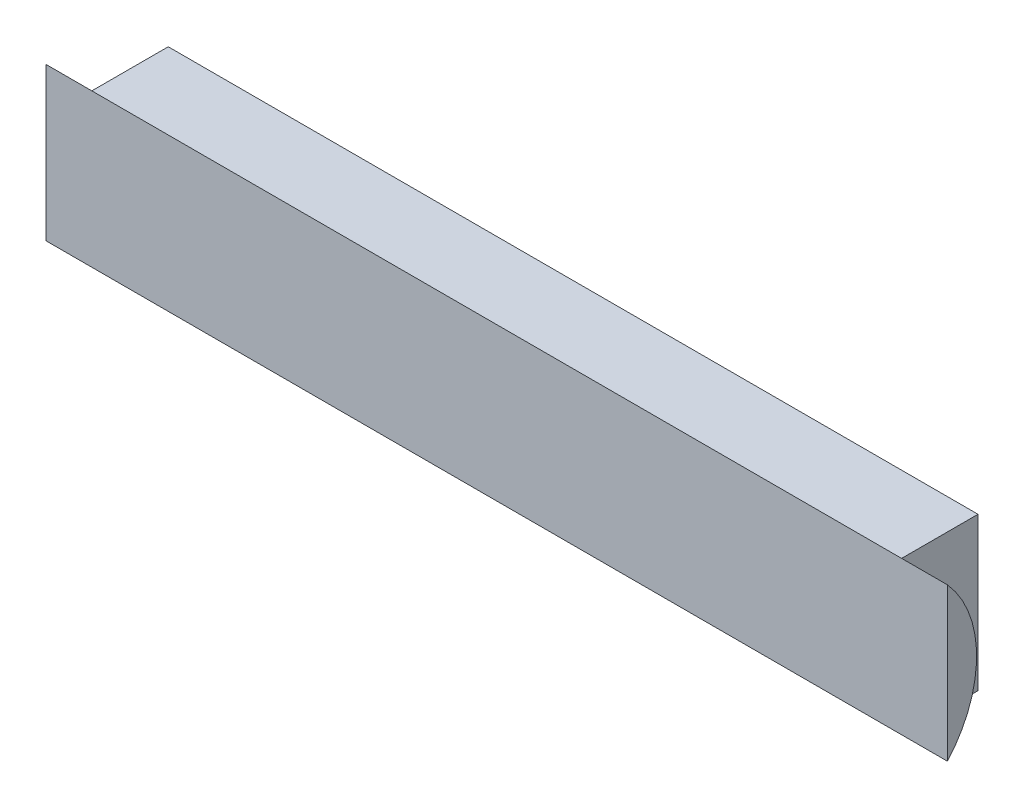
ISO-10303-21;
HEADER;
FILE_DESCRIPTION(('STEP AP214'),'2;1');
FILE_NAME('part.step','',(''),(''),'','','');
FILE_SCHEMA(('AUTOMOTIVE_DESIGN { 1 0 10303 214 1 1 1 1 }'));
ENDSEC;
DATA;
#1=APPLICATION_CONTEXT('core data for automotive mechanical design processes');
#2=APPLICATION_PROTOCOL_DEFINITION('international standard','automotive_design',2000,#1);
#3=PRODUCT_CONTEXT('',#1,'mechanical');
#4=PRODUCT('Part','Part','',(#3));
#5=PRODUCT_RELATED_PRODUCT_CATEGORY('part','',(#4));
#6=PRODUCT_DEFINITION_FORMATION('','',#4);
#7=PRODUCT_DEFINITION_CONTEXT('part definition',#1,'design');
#8=PRODUCT_DEFINITION('design','',#6,#7);
#9=PRODUCT_DEFINITION_SHAPE('','',#8);
#10=(LENGTH_UNIT() NAMED_UNIT(*) SI_UNIT(.MILLI.,.METRE.));
#11=(NAMED_UNIT(*) PLANE_ANGLE_UNIT() SI_UNIT($,.RADIAN.));
#12=(NAMED_UNIT(*) SI_UNIT($,.STERADIAN.) SOLID_ANGLE_UNIT());
#13=UNCERTAINTY_MEASURE_WITH_UNIT(LENGTH_MEASURE(1.E-05),#10,'distance_accuracy_value','');
#14=(GEOMETRIC_REPRESENTATION_CONTEXT(3) GLOBAL_UNCERTAINTY_ASSIGNED_CONTEXT((#13)) GLOBAL_UNIT_ASSIGNED_CONTEXT((#10,
#11,#12)) REPRESENTATION_CONTEXT('',''));
#15=CARTESIAN_POINT('',(0.,0.,0.));
#16=DIRECTION('',(0.,0.,1.));
#17=DIRECTION('',(1.,0.,0.));
#18=AXIS2_PLACEMENT_3D('',#15,#16,#17);
#19=CARTESIAN_POINT('',(26.5,5.,5.));
#20=DIRECTION('',(-1.,0.,0.));
#21=DIRECTION('',(0.,-1.,0.));
#22=AXIS2_PLACEMENT_3D('',#19,#20,#21);
#23=PLANE('',#22);
#24=CARTESIAN_POINT('',(26.5,0.,10.5901699437495));
#25=DIRECTION('',(1.,0.,0.));
#26=DIRECTION('',(0.,-1.,0.));
#27=AXIS2_PLACEMENT_3D('',#24,#25,#26);
#28=CIRCLE('',#27,7.5);
#29=CARTESIAN_POINT('',(26.5,-5.,5.));
#30=VERTEX_POINT('',#29);
#31=CARTESIAN_POINT('',(26.5,5.,5.));
#32=VERTEX_POINT('',#31);
#33=EDGE_CURVE('E56',#30,#32,#28,.T.);
#34=ORIENTED_EDGE('',*,*,#33,.F.);
#35=DIRECTION('',(0.,0.,-1.));
#36=VECTOR('',#35,1.);
#37=CARTESIAN_POINT('',(26.5,-5.,5.));
#38=LINE('',#37,#36);
#39=CARTESIAN_POINT('',(26.5,-5.,0.));
#40=VERTEX_POINT('',#39);
#41=EDGE_CURVE('E83',#30,#40,#38,.T.);
#42=ORIENTED_EDGE('',*,*,#41,.T.);
#43=DIRECTION('',(0.,1.,0.));
#44=VECTOR('',#43,1.);
#45=CARTESIAN_POINT('',(26.5,5.,0.));
#46=LINE('',#45,#44);
#47=CARTESIAN_POINT('',(26.5,5.,0.));
#48=VERTEX_POINT('',#47);
#49=EDGE_CURVE('E92',#40,#48,#46,.T.);
#50=ORIENTED_EDGE('',*,*,#49,.T.);
#51=DIRECTION('',(0.,0.,-1.));
#52=VECTOR('',#51,1.);
#53=CARTESIAN_POINT('',(26.5,5.,5.));
#54=LINE('',#53,#52);
#55=EDGE_CURVE('E11',#32,#48,#54,.T.);
#56=ORIENTED_EDGE('',*,*,#55,.F.);
#57=EDGE_LOOP('',(#34,#42,#50,#56));
#58=FACE_BOUND('',#57,.T.);
#59=ADVANCED_FACE('F39',(#58),#23,.F.);
#60=CARTESIAN_POINT('',(-26.5,5.,5.));
#61=DIRECTION('',(0.,-1.,0.));
#62=DIRECTION('',(0.,0.,-1.));
#63=AXIS2_PLACEMENT_3D('',#60,#61,#62);
#64=PLANE('',#63);
#65=DIRECTION('',(-1.,0.,0.));
#66=VECTOR('',#65,1.);
#67=CARTESIAN_POINT('',(-26.5,5.,0.));
#68=LINE('',#67,#66);
#69=CARTESIAN_POINT('',(-26.5,5.,0.));
#70=VERTEX_POINT('',#69);
#71=EDGE_CURVE('E97',#48,#70,#68,.T.);
#72=ORIENTED_EDGE('',*,*,#71,.T.);
#73=DIRECTION('',(0.,0.,-1.));
#74=VECTOR('',#73,1.);
#75=CARTESIAN_POINT('',(-26.5,5.,5.));
#76=LINE('',#75,#74);
#77=CARTESIAN_POINT('',(-26.5,5.,5.));
#78=VERTEX_POINT('',#77);
#79=EDGE_CURVE('E48',#78,#70,#76,.T.);
#80=ORIENTED_EDGE('',*,*,#79,.F.);
#81=DIRECTION('',(-1.,0.,0.));
#82=VECTOR('',#81,1.);
#83=CARTESIAN_POINT('',(-26.5,5.,5.));
#84=LINE('',#83,#82);
#85=EDGE_CURVE('E89',#32,#78,#84,.T.);
#86=ORIENTED_EDGE('',*,*,#85,.F.);
#87=ORIENTED_EDGE('',*,*,#55,.T.);
#88=EDGE_LOOP('',(#72,#80,#86,#87));
#89=FACE_BOUND('',#88,.T.);
#90=ADVANCED_FACE('F122',(#89),#64,.F.);
#91=CARTESIAN_POINT('',(-26.5,5.,5.));
#92=DIRECTION('',(1.,0.,0.));
#93=DIRECTION('',(0.,0.,-1.));
#94=AXIS2_PLACEMENT_3D('',#91,#92,#93);
#95=PLANE('',#94);
#96=CARTESIAN_POINT('',(-26.5,0.,10.5901699437495));
#97=DIRECTION('',(-1.,0.,0.));
#98=DIRECTION('',(0.,0.,-1.));
#99=AXIS2_PLACEMENT_3D('',#96,#97,#98);
#100=CIRCLE('',#99,7.5);
#101=CARTESIAN_POINT('',(-26.5,-5.,5.));
#102=VERTEX_POINT('',#101);
#103=EDGE_CURVE('E117',#78,#102,#100,.T.);
#104=ORIENTED_EDGE('',*,*,#103,.F.);
#105=ORIENTED_EDGE('',*,*,#79,.T.);
#106=DIRECTION('',(0.,-1.,0.));
#107=VECTOR('',#106,1.);
#108=CARTESIAN_POINT('',(-26.5,5.,0.));
#109=LINE('',#108,#107);
#110=CARTESIAN_POINT('',(-26.5,-5.,0.));
#111=VERTEX_POINT('',#110);
#112=EDGE_CURVE('E74',#70,#111,#109,.T.);
#113=ORIENTED_EDGE('',*,*,#112,.T.);
#114=DIRECTION('',(0.,0.,-1.));
#115=VECTOR('',#114,1.);
#116=CARTESIAN_POINT('',(-26.5,-5.,5.));
#117=LINE('',#116,#115);
#118=EDGE_CURVE('E85',#102,#111,#117,.T.);
#119=ORIENTED_EDGE('',*,*,#118,.F.);
#120=EDGE_LOOP('',(#104,#105,#113,#119));
#121=FACE_BOUND('',#120,.T.);
#122=ADVANCED_FACE('F115',(#121),#95,.F.);
#123=CARTESIAN_POINT('',(-26.5,-5.,5.));
#124=DIRECTION('',(0.,1.,0.));
#125=DIRECTION('',(0.,0.,1.));
#126=AXIS2_PLACEMENT_3D('',#123,#124,#125);
#127=PLANE('',#126);
#128=DIRECTION('',(1.,0.,0.));
#129=VECTOR('',#128,1.);
#130=CARTESIAN_POINT('',(-26.5,-5.,0.));
#131=LINE('',#130,#129);
#132=EDGE_CURVE('E80',#111,#40,#131,.T.);
#133=ORIENTED_EDGE('',*,*,#132,.T.);
#134=ORIENTED_EDGE('',*,*,#41,.F.);
#135=DIRECTION('',(1.,0.,0.));
#136=VECTOR('',#135,1.);
#137=CARTESIAN_POINT('',(-26.5,-5.,5.));
#138=LINE('',#137,#136);
#139=EDGE_CURVE('E94',#102,#30,#138,.T.);
#140=ORIENTED_EDGE('',*,*,#139,.F.);
#141=ORIENTED_EDGE('',*,*,#118,.T.);
#142=EDGE_LOOP('',(#133,#134,#140,#141));
#143=FACE_BOUND('',#142,.T.);
#144=ADVANCED_FACE('F81',(#143),#127,.F.);
#145=CARTESIAN_POINT('',(0.,0.,5.));
#146=DIRECTION('',(0.,0.,1.));
#147=DIRECTION('',(1.,0.,0.));
#148=AXIS2_PLACEMENT_3D('',#145,#146,#147);
#149=PLANE('',#148);
#150=ORIENTED_EDGE('',*,*,#139,.T.);
#151=DIRECTION('',(-1.,0.,0.));
#152=VECTOR('',#151,1.);
#153=CARTESIAN_POINT('',(29.5,-5.,5.));
#154=LINE('',#153,#152);
#155=CARTESIAN_POINT('',(29.5,-5.,5.));
#156=VERTEX_POINT('',#155);
#157=EDGE_CURVE('E105',#156,#30,#154,.T.);
#158=ORIENTED_EDGE('',*,*,#157,.F.);
#159=DIRECTION('',(0.,-1.,0.));
#160=VECTOR('',#159,1.);
#161=CARTESIAN_POINT('',(29.5,5.,5.));
#162=LINE('',#161,#160);
#163=CARTESIAN_POINT('',(29.5,5.,5.));
#164=VERTEX_POINT('',#163);
#165=EDGE_CURVE('E152',#164,#156,#162,.T.);
#166=ORIENTED_EDGE('',*,*,#165,.F.);
#167=DIRECTION('',(-1.,0.,0.));
#168=VECTOR('',#167,1.);
#169=CARTESIAN_POINT('',(29.5,5.,5.));
#170=LINE('',#169,#168);
#171=EDGE_CURVE('E99',#164,#32,#170,.T.);
#172=ORIENTED_EDGE('',*,*,#171,.T.);
#173=ORIENTED_EDGE('',*,*,#85,.T.);
#174=DIRECTION('',(1.,0.,0.));
#175=VECTOR('',#174,1.);
#176=CARTESIAN_POINT('',(-29.5,5.,5.));
#177=LINE('',#176,#175);
#178=CARTESIAN_POINT('',(-29.5,5.,5.));
#179=VERTEX_POINT('',#178);
#180=EDGE_CURVE('E127',#179,#78,#177,.T.);
#181=ORIENTED_EDGE('',*,*,#180,.F.);
#182=DIRECTION('',(0.,1.,0.));
#183=VECTOR('',#182,1.);
#184=CARTESIAN_POINT('',(-29.5,-5.,5.));
#185=LINE('',#184,#183);
#186=CARTESIAN_POINT('',(-29.5,-5.,5.));
#187=VERTEX_POINT('',#186);
#188=EDGE_CURVE('E138',#187,#179,#185,.T.);
#189=ORIENTED_EDGE('',*,*,#188,.F.);
#190=DIRECTION('',(1.,0.,0.));
#191=VECTOR('',#190,1.);
#192=CARTESIAN_POINT('',(-29.5,-5.,5.));
#193=LINE('',#192,#191);
#194=EDGE_CURVE('E137',#187,#102,#193,.T.);
#195=ORIENTED_EDGE('',*,*,#194,.T.);
#196=EDGE_LOOP('',(#150,#158,#166,#172,#173,#181,#189,#195));
#197=FACE_BOUND('',#196,.T.);
#198=ADVANCED_FACE('F162',(#197),#149,.T.);
#199=CARTESIAN_POINT('',(0.,0.,0.));
#200=DIRECTION('',(0.,0.,1.));
#201=DIRECTION('',(1.,0.,0.));
#202=AXIS2_PLACEMENT_3D('',#199,#200,#201);
#203=PLANE('',#202);
#204=ORIENTED_EDGE('',*,*,#49,.F.);
#205=ORIENTED_EDGE('',*,*,#132,.F.);
#206=ORIENTED_EDGE('',*,*,#112,.F.);
#207=ORIENTED_EDGE('',*,*,#71,.F.);
#208=EDGE_LOOP('',(#204,#205,#206,#207));
#209=FACE_BOUND('',#208,.T.);
#210=ADVANCED_FACE('F96',(#209),#203,.F.);
#211=CARTESIAN_POINT('',(29.5,0.,10.5901699437495));
#212=DIRECTION('',(-1.,0.,0.));
#213=DIRECTION('',(0.,-1.,0.));
#214=AXIS2_PLACEMENT_3D('',#211,#212,#213);
#215=CYLINDRICAL_SURFACE('',#214,7.5);
#216=ORIENTED_EDGE('',*,*,#33,.T.);
#217=ORIENTED_EDGE('',*,*,#171,.F.);
#218=CARTESIAN_POINT('',(29.5,0.,10.5901699437495));
#219=DIRECTION('',(1.,0.,0.));
#220=DIRECTION('',(0.,-1.,0.));
#221=AXIS2_PLACEMENT_3D('',#218,#219,#220);
#222=CIRCLE('',#221,7.5);
#223=EDGE_CURVE('E148',#156,#164,#222,.T.);
#224=ORIENTED_EDGE('',*,*,#223,.F.);
#225=ORIENTED_EDGE('',*,*,#157,.T.);
#226=EDGE_LOOP('',(#216,#217,#224,#225));
#227=FACE_BOUND('',#226,.T.);
#228=ADVANCED_FACE('F197',(#227),#215,.T.);
#229=CARTESIAN_POINT('',(29.5,0.,10.5901699437495));
#230=DIRECTION('',(-1.,0.,0.));
#231=DIRECTION('',(0.,-1.,0.));
#232=AXIS2_PLACEMENT_3D('',#229,#230,#231);
#233=PLANE('',#232);
#234=ORIENTED_EDGE('',*,*,#223,.T.);
#235=ORIENTED_EDGE('',*,*,#165,.T.);
#236=EDGE_LOOP('',(#234,#235));
#237=FACE_BOUND('',#236,.T.);
#238=ADVANCED_FACE('F182',(#237),#233,.F.);
#239=CARTESIAN_POINT('',(-29.5,0.,10.5901699437495));
#240=DIRECTION('',(1.,0.,0.));
#241=DIRECTION('',(0.,0.,-1.));
#242=AXIS2_PLACEMENT_3D('',#239,#240,#241);
#243=CYLINDRICAL_SURFACE('',#242,7.5);
#244=ORIENTED_EDGE('',*,*,#103,.T.);
#245=ORIENTED_EDGE('',*,*,#194,.F.);
#246=CARTESIAN_POINT('',(-29.5,0.,10.5901699437495));
#247=DIRECTION('',(-1.,0.,0.));
#248=DIRECTION('',(0.,0.,-1.));
#249=AXIS2_PLACEMENT_3D('',#246,#247,#248);
#250=CIRCLE('',#249,7.5);
#251=EDGE_CURVE('E133',#179,#187,#250,.T.);
#252=ORIENTED_EDGE('',*,*,#251,.F.);
#253=ORIENTED_EDGE('',*,*,#180,.T.);
#254=EDGE_LOOP('',(#244,#245,#252,#253));
#255=FACE_BOUND('',#254,.T.);
#256=ADVANCED_FACE('F128',(#255),#243,.T.);
#257=CARTESIAN_POINT('',(-29.5,0.,10.5901699437495));
#258=DIRECTION('',(1.,0.,0.));
#259=DIRECTION('',(0.,0.,-1.));
#260=AXIS2_PLACEMENT_3D('',#257,#258,#259);
#261=PLANE('',#260);
#262=ORIENTED_EDGE('',*,*,#251,.T.);
#263=ORIENTED_EDGE('',*,*,#188,.T.);
#264=EDGE_LOOP('',(#262,#263));
#265=FACE_BOUND('',#264,.T.);
#266=ADVANCED_FACE('F173',(#265),#261,.F.);
#267=CLOSED_SHELL('',(#59,#90,#122,#144,#198,#210,#228,#238,#256,#266));
#268=MANIFOLD_SOLID_BREP('B2',#267);
#269=ADVANCED_BREP_SHAPE_REPRESENTATION('',(#18,#268),#14);
#270=SHAPE_DEFINITION_REPRESENTATION(#9,#269);
ENDSEC;
END-ISO-10303-21;
